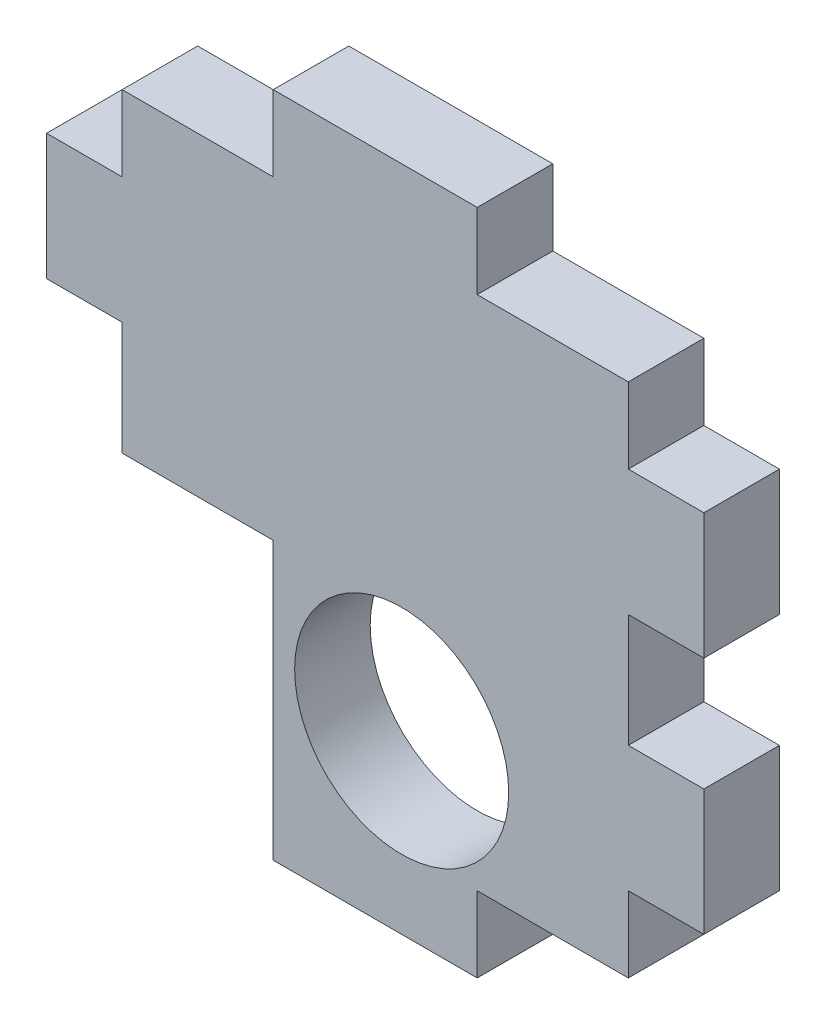
ISO-10303-21;
HEADER;
FILE_DESCRIPTION(('STEP AP214'),'2;1');
FILE_NAME('part.step','',(''),(''),'','','');
FILE_SCHEMA(('AUTOMOTIVE_DESIGN { 1 0 10303 214 1 1 1 1 }'));
ENDSEC;
DATA;
#1=APPLICATION_CONTEXT('core data for automotive mechanical design processes');
#2=APPLICATION_PROTOCOL_DEFINITION('international standard','automotive_design',2000,#1);
#3=PRODUCT_CONTEXT('',#1,'mechanical');
#4=PRODUCT('Part','Part','',(#3));
#5=PRODUCT_RELATED_PRODUCT_CATEGORY('part','',(#4));
#6=PRODUCT_DEFINITION_FORMATION('','',#4);
#7=PRODUCT_DEFINITION_CONTEXT('part definition',#1,'design');
#8=PRODUCT_DEFINITION('design','',#6,#7);
#9=PRODUCT_DEFINITION_SHAPE('','',#8);
#10=(LENGTH_UNIT() NAMED_UNIT(*) SI_UNIT(.MILLI.,.METRE.));
#11=(NAMED_UNIT(*) PLANE_ANGLE_UNIT() SI_UNIT($,.RADIAN.));
#12=(NAMED_UNIT(*) SI_UNIT($,.STERADIAN.) SOLID_ANGLE_UNIT());
#13=UNCERTAINTY_MEASURE_WITH_UNIT(LENGTH_MEASURE(1.E-05),#10,'distance_accuracy_value','');
#14=(GEOMETRIC_REPRESENTATION_CONTEXT(3) GLOBAL_UNCERTAINTY_ASSIGNED_CONTEXT((#13)) GLOBAL_UNIT_ASSIGNED_CONTEXT((#10,
#11,#12)) REPRESENTATION_CONTEXT('',''));
#15=CARTESIAN_POINT('',(0.,0.,0.));
#16=DIRECTION('',(0.,0.,1.));
#17=DIRECTION('',(1.,0.,0.));
#18=AXIS2_PLACEMENT_3D('',#15,#16,#17);
#19=CARTESIAN_POINT('',(6.,0.,3.));
#20=DIRECTION('',(1.,0.,0.));
#21=DIRECTION('',(0.,0.,-1.));
#22=AXIS2_PLACEMENT_3D('',#19,#20,#21);
#23=PLANE('',#22);
#24=DIRECTION('',(0.,-1.,0.));
#25=VECTOR('',#24,1.);
#26=CARTESIAN_POINT('',(6.,0.,0.));
#27=LINE('',#26,#25);
#28=CARTESIAN_POINT('',(6.,8.,0.));
#29=VERTEX_POINT('',#28);
#30=CARTESIAN_POINT('',(6.,-3.,0.));
#31=VERTEX_POINT('',#30);
#32=EDGE_CURVE('E49',#29,#31,#27,.T.);
#33=ORIENTED_EDGE('',*,*,#32,.T.);
#34=DIRECTION('',(0.,0.,-1.));
#35=VECTOR('',#34,1.);
#36=CARTESIAN_POINT('',(6.,-3.,3.));
#37=LINE('',#36,#35);
#38=CARTESIAN_POINT('',(6.,-3.,3.));
#39=VERTEX_POINT('',#38);
#40=EDGE_CURVE('E11',#39,#31,#37,.T.);
#41=ORIENTED_EDGE('',*,*,#40,.F.);
#42=DIRECTION('',(0.,-1.,0.));
#43=VECTOR('',#42,1.);
#44=CARTESIAN_POINT('',(6.,0.,3.));
#45=LINE('',#44,#43);
#46=CARTESIAN_POINT('',(6.,8.,3.));
#47=VERTEX_POINT('',#46);
#48=EDGE_CURVE('E140',#47,#39,#45,.T.);
#49=ORIENTED_EDGE('',*,*,#48,.F.);
#50=DIRECTION('',(0.,0.,1.));
#51=VECTOR('',#50,1.);
#52=CARTESIAN_POINT('',(6.,8.,0.));
#53=LINE('',#52,#51);
#54=EDGE_CURVE('E404',#29,#47,#53,.T.);
#55=ORIENTED_EDGE('',*,*,#54,.F.);
#56=EDGE_LOOP('',(#33,#41,#49,#55));
#57=FACE_BOUND('',#56,.T.);
#58=ADVANCED_FACE('F35',(#57),#23,.F.);
#59=CARTESIAN_POINT('',(6.,-3.,3.));
#60=DIRECTION('',(0.,1.,0.));
#61=DIRECTION('',(0.,0.,1.));
#62=AXIS2_PLACEMENT_3D('',#59,#60,#61);
#63=PLANE('',#62);
#64=DIRECTION('',(1.,0.,0.));
#65=VECTOR('',#64,1.);
#66=CARTESIAN_POINT('',(6.,-3.,0.));
#67=LINE('',#66,#65);
#68=CARTESIAN_POINT('',(14.1,-3.,0.));
#69=VERTEX_POINT('',#68);
#70=EDGE_CURVE('E229',#31,#69,#67,.T.);
#71=ORIENTED_EDGE('',*,*,#70,.T.);
#72=DIRECTION('',(0.,0.,-1.));
#73=VECTOR('',#72,1.);
#74=CARTESIAN_POINT('',(14.1,-3.,3.));
#75=LINE('',#74,#73);
#76=CARTESIAN_POINT('',(14.1,-3.,3.));
#77=VERTEX_POINT('',#76);
#78=EDGE_CURVE('E42',#77,#69,#75,.T.);
#79=ORIENTED_EDGE('',*,*,#78,.F.);
#80=DIRECTION('',(1.,0.,0.));
#81=VECTOR('',#80,1.);
#82=CARTESIAN_POINT('',(6.,-3.,3.));
#83=LINE('',#82,#81);
#84=EDGE_CURVE('E406',#39,#77,#83,.T.);
#85=ORIENTED_EDGE('',*,*,#84,.F.);
#86=ORIENTED_EDGE('',*,*,#40,.T.);
#87=EDGE_LOOP('',(#71,#79,#85,#86));
#88=FACE_BOUND('',#87,.T.);
#89=ADVANCED_FACE('F417',(#88),#63,.F.);
#90=CARTESIAN_POINT('',(14.1,-3.,3.));
#91=DIRECTION('',(-1.,0.,0.));
#92=DIRECTION('',(0.,-1.,0.));
#93=AXIS2_PLACEMENT_3D('',#90,#91,#92);
#94=PLANE('',#93);
#95=DIRECTION('',(0.,1.,0.));
#96=VECTOR('',#95,1.);
#97=CARTESIAN_POINT('',(14.1,-3.,0.));
#98=LINE('',#97,#96);
#99=CARTESIAN_POINT('',(14.1,0.,0.));
#100=VERTEX_POINT('',#99);
#101=EDGE_CURVE('E232',#69,#100,#98,.T.);
#102=ORIENTED_EDGE('',*,*,#101,.T.);
#103=DIRECTION('',(0.,0.,-1.));
#104=VECTOR('',#103,1.);
#105=CARTESIAN_POINT('',(14.1,0.,3.));
#106=LINE('',#105,#104);
#107=CARTESIAN_POINT('',(14.1,0.,3.));
#108=VERTEX_POINT('',#107);
#109=EDGE_CURVE('E324',#108,#100,#106,.T.);
#110=ORIENTED_EDGE('',*,*,#109,.F.);
#111=DIRECTION('',(0.,1.,0.));
#112=VECTOR('',#111,1.);
#113=CARTESIAN_POINT('',(14.1,-3.,3.));
#114=LINE('',#113,#112);
#115=EDGE_CURVE('E333',#77,#108,#114,.T.);
#116=ORIENTED_EDGE('',*,*,#115,.F.);
#117=ORIENTED_EDGE('',*,*,#78,.T.);
#118=EDGE_LOOP('',(#102,#110,#116,#117));
#119=FACE_BOUND('',#118,.T.);
#120=ADVANCED_FACE('F331',(#119),#94,.F.);
#121=CARTESIAN_POINT('',(14.1,0.,3.));
#122=DIRECTION('',(0.,1.,0.));
#123=DIRECTION('',(0.,0.,1.));
#124=AXIS2_PLACEMENT_3D('',#121,#122,#123);
#125=PLANE('',#124);
#126=DIRECTION('',(1.,0.,0.));
#127=VECTOR('',#126,1.);
#128=CARTESIAN_POINT('',(14.1,0.,0.));
#129=LINE('',#128,#127);
#130=CARTESIAN_POINT('',(20.1,0.,0.));
#131=VERTEX_POINT('',#130);
#132=EDGE_CURVE('E234',#100,#131,#129,.T.);
#133=ORIENTED_EDGE('',*,*,#132,.T.);
#134=DIRECTION('',(0.,0.,-1.));
#135=VECTOR('',#134,1.);
#136=CARTESIAN_POINT('',(20.1,0.,3.));
#137=LINE('',#136,#135);
#138=CARTESIAN_POINT('',(20.1,0.,3.));
#139=VERTEX_POINT('',#138);
#140=EDGE_CURVE('E321',#139,#131,#137,.T.);
#141=ORIENTED_EDGE('',*,*,#140,.F.);
#142=DIRECTION('',(1.,0.,0.));
#143=VECTOR('',#142,1.);
#144=CARTESIAN_POINT('',(14.1,0.,3.));
#145=LINE('',#144,#143);
#146=EDGE_CURVE('E351',#108,#139,#145,.T.);
#147=ORIENTED_EDGE('',*,*,#146,.F.);
#148=ORIENTED_EDGE('',*,*,#109,.T.);
#149=EDGE_LOOP('',(#133,#141,#147,#148));
#150=FACE_BOUND('',#149,.T.);
#151=ADVANCED_FACE('F342',(#150),#125,.F.);
#152=CARTESIAN_POINT('',(20.1,0.,3.));
#153=DIRECTION('',(-1.,0.,0.));
#154=DIRECTION('',(0.,-1.,0.));
#155=AXIS2_PLACEMENT_3D('',#152,#153,#154);
#156=PLANE('',#155);
#157=DIRECTION('',(0.,1.,0.));
#158=VECTOR('',#157,1.);
#159=CARTESIAN_POINT('',(20.1,0.,0.));
#160=LINE('',#159,#158);
#161=CARTESIAN_POINT('',(20.1,3.,0.));
#162=VERTEX_POINT('',#161);
#163=EDGE_CURVE('E236',#131,#162,#160,.T.);
#164=ORIENTED_EDGE('',*,*,#163,.T.);
#165=DIRECTION('',(0.,0.,-1.));
#166=VECTOR('',#165,1.);
#167=CARTESIAN_POINT('',(20.1,3.,3.));
#168=LINE('',#167,#166);
#169=CARTESIAN_POINT('',(20.1,3.,3.));
#170=VERTEX_POINT('',#169);
#171=EDGE_CURVE('E318',#170,#162,#168,.T.);
#172=ORIENTED_EDGE('',*,*,#171,.F.);
#173=DIRECTION('',(0.,1.,0.));
#174=VECTOR('',#173,1.);
#175=CARTESIAN_POINT('',(20.1,0.,3.));
#176=LINE('',#175,#174);
#177=EDGE_CURVE('E348',#139,#170,#176,.T.);
#178=ORIENTED_EDGE('',*,*,#177,.F.);
#179=ORIENTED_EDGE('',*,*,#140,.T.);
#180=EDGE_LOOP('',(#164,#172,#178,#179));
#181=FACE_BOUND('',#180,.T.);
#182=ADVANCED_FACE('F346',(#181),#156,.F.);
#183=CARTESIAN_POINT('',(20.1,3.,3.));
#184=DIRECTION('',(0.,1.,0.));
#185=DIRECTION('',(0.,0.,1.));
#186=AXIS2_PLACEMENT_3D('',#183,#184,#185);
#187=PLANE('',#186);
#188=DIRECTION('',(1.,0.,0.));
#189=VECTOR('',#188,1.);
#190=CARTESIAN_POINT('',(20.1,3.,0.));
#191=LINE('',#190,#189);
#192=CARTESIAN_POINT('',(23.1,3.,0.));
#193=VERTEX_POINT('',#192);
#194=EDGE_CURVE('E238',#162,#193,#191,.T.);
#195=ORIENTED_EDGE('',*,*,#194,.T.);
#196=DIRECTION('',(0.,0.,-1.));
#197=VECTOR('',#196,1.);
#198=CARTESIAN_POINT('',(23.1,3.,3.));
#199=LINE('',#198,#197);
#200=CARTESIAN_POINT('',(23.1,3.,3.));
#201=VERTEX_POINT('',#200);
#202=EDGE_CURVE('E315',#201,#193,#199,.T.);
#203=ORIENTED_EDGE('',*,*,#202,.F.);
#204=DIRECTION('',(1.,0.,0.));
#205=VECTOR('',#204,1.);
#206=CARTESIAN_POINT('',(20.1,3.,3.));
#207=LINE('',#206,#205);
#208=EDGE_CURVE('E350',#170,#201,#207,.T.);
#209=ORIENTED_EDGE('',*,*,#208,.F.);
#210=ORIENTED_EDGE('',*,*,#171,.T.);
#211=EDGE_LOOP('',(#195,#203,#209,#210));
#212=FACE_BOUND('',#211,.T.);
#213=ADVANCED_FACE('F429',(#212),#187,.F.);
#214=CARTESIAN_POINT('',(23.1,3.,3.));
#215=DIRECTION('',(-1.,0.,0.));
#216=DIRECTION('',(0.,-1.,0.));
#217=AXIS2_PLACEMENT_3D('',#214,#215,#216);
#218=PLANE('',#217);
#219=DIRECTION('',(0.,1.,0.));
#220=VECTOR('',#219,1.);
#221=CARTESIAN_POINT('',(23.1,3.,0.));
#222=LINE('',#221,#220);
#223=CARTESIAN_POINT('',(23.1,8.,0.));
#224=VERTEX_POINT('',#223);
#225=EDGE_CURVE('E240',#193,#224,#222,.T.);
#226=ORIENTED_EDGE('',*,*,#225,.T.);
#227=DIRECTION('',(0.,0.,-1.));
#228=VECTOR('',#227,1.);
#229=CARTESIAN_POINT('',(23.1,8.,3.));
#230=LINE('',#229,#228);
#231=CARTESIAN_POINT('',(23.1,8.,3.));
#232=VERTEX_POINT('',#231);
#233=EDGE_CURVE('E312',#232,#224,#230,.T.);
#234=ORIENTED_EDGE('',*,*,#233,.F.);
#235=DIRECTION('',(0.,1.,0.));
#236=VECTOR('',#235,1.);
#237=CARTESIAN_POINT('',(23.1,3.,3.));
#238=LINE('',#237,#236);
#239=EDGE_CURVE('E353',#201,#232,#238,.T.);
#240=ORIENTED_EDGE('',*,*,#239,.F.);
#241=ORIENTED_EDGE('',*,*,#202,.T.);
#242=EDGE_LOOP('',(#226,#234,#240,#241));
#243=FACE_BOUND('',#242,.T.);
#244=ADVANCED_FACE('F432',(#243),#218,.F.);
#245=CARTESIAN_POINT('',(23.1,8.,3.));
#246=DIRECTION('',(0.,-1.,0.));
#247=DIRECTION('',(1.,0.,0.));
#248=AXIS2_PLACEMENT_3D('',#245,#246,#247);
#249=PLANE('',#248);
#250=DIRECTION('',(-1.,0.,0.));
#251=VECTOR('',#250,1.);
#252=CARTESIAN_POINT('',(23.1,8.,0.));
#253=LINE('',#252,#251);
#254=CARTESIAN_POINT('',(20.1,8.,0.));
#255=VERTEX_POINT('',#254);
#256=EDGE_CURVE('E242',#224,#255,#253,.T.);
#257=ORIENTED_EDGE('',*,*,#256,.T.);
#258=DIRECTION('',(0.,0.,-1.));
#259=VECTOR('',#258,1.);
#260=CARTESIAN_POINT('',(20.1,8.,3.));
#261=LINE('',#260,#259);
#262=CARTESIAN_POINT('',(20.1,8.,3.));
#263=VERTEX_POINT('',#262);
#264=EDGE_CURVE('E309',#263,#255,#261,.T.);
#265=ORIENTED_EDGE('',*,*,#264,.F.);
#266=DIRECTION('',(-1.,0.,0.));
#267=VECTOR('',#266,1.);
#268=CARTESIAN_POINT('',(23.1,8.,3.));
#269=LINE('',#268,#267);
#270=EDGE_CURVE('E359',#232,#263,#269,.T.);
#271=ORIENTED_EDGE('',*,*,#270,.F.);
#272=ORIENTED_EDGE('',*,*,#233,.T.);
#273=EDGE_LOOP('',(#257,#265,#271,#272));
#274=FACE_BOUND('',#273,.T.);
#275=ADVANCED_FACE('F436',(#274),#249,.F.);
#276=CARTESIAN_POINT('',(20.1,8.,3.));
#277=DIRECTION('',(-1.,0.,0.));
#278=DIRECTION('',(0.,-1.,0.));
#279=AXIS2_PLACEMENT_3D('',#276,#277,#278);
#280=PLANE('',#279);
#281=DIRECTION('',(0.,1.,0.));
#282=VECTOR('',#281,1.);
#283=CARTESIAN_POINT('',(20.1,8.,0.));
#284=LINE('',#283,#282);
#285=CARTESIAN_POINT('',(20.1,12.5,0.));
#286=VERTEX_POINT('',#285);
#287=EDGE_CURVE('E244',#255,#286,#284,.T.);
#288=ORIENTED_EDGE('',*,*,#287,.T.);
#289=DIRECTION('',(0.,0.,-1.));
#290=VECTOR('',#289,1.);
#291=CARTESIAN_POINT('',(20.1,12.5,3.));
#292=LINE('',#291,#290);
#293=CARTESIAN_POINT('',(20.1,12.5,3.));
#294=VERTEX_POINT('',#293);
#295=EDGE_CURVE('E306',#294,#286,#292,.T.);
#296=ORIENTED_EDGE('',*,*,#295,.F.);
#297=DIRECTION('',(0.,1.,0.));
#298=VECTOR('',#297,1.);
#299=CARTESIAN_POINT('',(20.1,8.,3.));
#300=LINE('',#299,#298);
#301=EDGE_CURVE('E361',#263,#294,#300,.T.);
#302=ORIENTED_EDGE('',*,*,#301,.F.);
#303=ORIENTED_EDGE('',*,*,#264,.T.);
#304=EDGE_LOOP('',(#288,#296,#302,#303));
#305=FACE_BOUND('',#304,.T.);
#306=ADVANCED_FACE('F440',(#305),#280,.F.);
#307=CARTESIAN_POINT('',(20.1,12.5,3.));
#308=DIRECTION('',(0.,1.,0.));
#309=DIRECTION('',(0.,0.,1.));
#310=AXIS2_PLACEMENT_3D('',#307,#308,#309);
#311=PLANE('',#310);
#312=DIRECTION('',(1.,0.,0.));
#313=VECTOR('',#312,1.);
#314=CARTESIAN_POINT('',(20.1,12.5,0.));
#315=LINE('',#314,#313);
#316=CARTESIAN_POINT('',(23.1,12.5,0.));
#317=VERTEX_POINT('',#316);
#318=EDGE_CURVE('E246',#286,#317,#315,.T.);
#319=ORIENTED_EDGE('',*,*,#318,.T.);
#320=DIRECTION('',(0.,0.,-1.));
#321=VECTOR('',#320,1.);
#322=CARTESIAN_POINT('',(23.1,12.5,3.));
#323=LINE('',#322,#321);
#324=CARTESIAN_POINT('',(23.1,12.5,3.));
#325=VERTEX_POINT('',#324);
#326=EDGE_CURVE('E303',#325,#317,#323,.T.);
#327=ORIENTED_EDGE('',*,*,#326,.F.);
#328=DIRECTION('',(1.,0.,0.));
#329=VECTOR('',#328,1.);
#330=CARTESIAN_POINT('',(20.1,12.5,3.));
#331=LINE('',#330,#329);
#332=EDGE_CURVE('E363',#294,#325,#331,.T.);
#333=ORIENTED_EDGE('',*,*,#332,.F.);
#334=ORIENTED_EDGE('',*,*,#295,.T.);
#335=EDGE_LOOP('',(#319,#327,#333,#334));
#336=FACE_BOUND('',#335,.T.);
#337=ADVANCED_FACE('F444',(#336),#311,.F.);
#338=CARTESIAN_POINT('',(23.1,12.5,3.));
#339=DIRECTION('',(-1.,0.,0.));
#340=DIRECTION('',(0.,-1.,0.));
#341=AXIS2_PLACEMENT_3D('',#338,#339,#340);
#342=PLANE('',#341);
#343=DIRECTION('',(0.,1.,0.));
#344=VECTOR('',#343,1.);
#345=CARTESIAN_POINT('',(23.1,12.5,0.));
#346=LINE('',#345,#344);
#347=CARTESIAN_POINT('',(23.1,17.5,0.));
#348=VERTEX_POINT('',#347);
#349=EDGE_CURVE('E248',#317,#348,#346,.T.);
#350=ORIENTED_EDGE('',*,*,#349,.T.);
#351=DIRECTION('',(0.,0.,-1.));
#352=VECTOR('',#351,1.);
#353=CARTESIAN_POINT('',(23.1,17.5,3.));
#354=LINE('',#353,#352);
#355=CARTESIAN_POINT('',(23.1,17.5,3.));
#356=VERTEX_POINT('',#355);
#357=EDGE_CURVE('E300',#356,#348,#354,.T.);
#358=ORIENTED_EDGE('',*,*,#357,.F.);
#359=DIRECTION('',(0.,1.,0.));
#360=VECTOR('',#359,1.);
#361=CARTESIAN_POINT('',(23.1,12.5,3.));
#362=LINE('',#361,#360);
#363=EDGE_CURVE('E365',#325,#356,#362,.T.);
#364=ORIENTED_EDGE('',*,*,#363,.F.);
#365=ORIENTED_EDGE('',*,*,#326,.T.);
#366=EDGE_LOOP('',(#350,#358,#364,#365));
#367=FACE_BOUND('',#366,.T.);
#368=ADVANCED_FACE('F448',(#367),#342,.F.);
#369=CARTESIAN_POINT('',(23.1,17.5,3.));
#370=DIRECTION('',(0.,-1.,0.));
#371=DIRECTION('',(0.,0.,-1.));
#372=AXIS2_PLACEMENT_3D('',#369,#370,#371);
#373=PLANE('',#372);
#374=DIRECTION('',(-1.,0.,0.));
#375=VECTOR('',#374,1.);
#376=CARTESIAN_POINT('',(23.1,17.5,0.));
#377=LINE('',#376,#375);
#378=CARTESIAN_POINT('',(20.1,17.5,0.));
#379=VERTEX_POINT('',#378);
#380=EDGE_CURVE('E250',#348,#379,#377,.T.);
#381=ORIENTED_EDGE('',*,*,#380,.T.);
#382=DIRECTION('',(0.,0.,-1.));
#383=VECTOR('',#382,1.);
#384=CARTESIAN_POINT('',(20.1,17.5,3.));
#385=LINE('',#384,#383);
#386=CARTESIAN_POINT('',(20.1,17.5,3.));
#387=VERTEX_POINT('',#386);
#388=EDGE_CURVE('E297',#387,#379,#385,.T.);
#389=ORIENTED_EDGE('',*,*,#388,.F.);
#390=DIRECTION('',(-1.,0.,0.));
#391=VECTOR('',#390,1.);
#392=CARTESIAN_POINT('',(23.1,17.5,3.));
#393=LINE('',#392,#391);
#394=EDGE_CURVE('E367',#356,#387,#393,.T.);
#395=ORIENTED_EDGE('',*,*,#394,.F.);
#396=ORIENTED_EDGE('',*,*,#357,.T.);
#397=EDGE_LOOP('',(#381,#389,#395,#396));
#398=FACE_BOUND('',#397,.T.);
#399=ADVANCED_FACE('F452',(#398),#373,.F.);
#400=CARTESIAN_POINT('',(20.1,17.5,3.));
#401=DIRECTION('',(-1.,0.,0.));
#402=DIRECTION('',(0.,0.,1.));
#403=AXIS2_PLACEMENT_3D('',#400,#401,#402);
#404=PLANE('',#403);
#405=DIRECTION('',(0.,1.,0.));
#406=VECTOR('',#405,1.);
#407=CARTESIAN_POINT('',(20.1,17.5,0.));
#408=LINE('',#407,#406);
#409=CARTESIAN_POINT('',(20.1,20.5,0.));
#410=VERTEX_POINT('',#409);
#411=EDGE_CURVE('E252',#379,#410,#408,.T.);
#412=ORIENTED_EDGE('',*,*,#411,.T.);
#413=DIRECTION('',(0.,0.,-1.));
#414=VECTOR('',#413,1.);
#415=CARTESIAN_POINT('',(20.1,20.5,3.));
#416=LINE('',#415,#414);
#417=CARTESIAN_POINT('',(20.1,20.5,3.));
#418=VERTEX_POINT('',#417);
#419=EDGE_CURVE('E294',#418,#410,#416,.T.);
#420=ORIENTED_EDGE('',*,*,#419,.F.);
#421=DIRECTION('',(0.,1.,0.));
#422=VECTOR('',#421,1.);
#423=CARTESIAN_POINT('',(20.1,17.5,3.));
#424=LINE('',#423,#422);
#425=EDGE_CURVE('E369',#387,#418,#424,.T.);
#426=ORIENTED_EDGE('',*,*,#425,.F.);
#427=ORIENTED_EDGE('',*,*,#388,.T.);
#428=EDGE_LOOP('',(#412,#420,#426,#427));
#429=FACE_BOUND('',#428,.T.);
#430=ADVANCED_FACE('F456',(#429),#404,.F.);
#431=CARTESIAN_POINT('',(20.1,20.5,3.));
#432=DIRECTION('',(0.,-1.,0.));
#433=DIRECTION('',(0.,0.,-1.));
#434=AXIS2_PLACEMENT_3D('',#431,#432,#433);
#435=PLANE('',#434);
#436=DIRECTION('',(-1.,0.,0.));
#437=VECTOR('',#436,1.);
#438=CARTESIAN_POINT('',(20.1,20.5,0.));
#439=LINE('',#438,#437);
#440=CARTESIAN_POINT('',(14.1,20.5,0.));
#441=VERTEX_POINT('',#440);
#442=EDGE_CURVE('E254',#410,#441,#439,.T.);
#443=ORIENTED_EDGE('',*,*,#442,.T.);
#444=DIRECTION('',(0.,0.,-1.));
#445=VECTOR('',#444,1.);
#446=CARTESIAN_POINT('',(14.1,20.5,3.));
#447=LINE('',#446,#445);
#448=CARTESIAN_POINT('',(14.1,20.5,3.));
#449=VERTEX_POINT('',#448);
#450=EDGE_CURVE('E291',#449,#441,#447,.T.);
#451=ORIENTED_EDGE('',*,*,#450,.F.);
#452=DIRECTION('',(-1.,0.,0.));
#453=VECTOR('',#452,1.);
#454=CARTESIAN_POINT('',(20.1,20.5,3.));
#455=LINE('',#454,#453);
#456=EDGE_CURVE('E371',#418,#449,#455,.T.);
#457=ORIENTED_EDGE('',*,*,#456,.F.);
#458=ORIENTED_EDGE('',*,*,#419,.T.);
#459=EDGE_LOOP('',(#443,#451,#457,#458));
#460=FACE_BOUND('',#459,.T.);
#461=ADVANCED_FACE('F460',(#460),#435,.F.);
#462=CARTESIAN_POINT('',(14.1,20.5,3.));
#463=DIRECTION('',(-1.,0.,0.));
#464=DIRECTION('',(0.,0.,1.));
#465=AXIS2_PLACEMENT_3D('',#462,#463,#464);
#466=PLANE('',#465);
#467=DIRECTION('',(0.,1.,0.));
#468=VECTOR('',#467,1.);
#469=CARTESIAN_POINT('',(14.1,20.5,0.));
#470=LINE('',#469,#468);
#471=CARTESIAN_POINT('',(14.1,23.5,0.));
#472=VERTEX_POINT('',#471);
#473=EDGE_CURVE('E256',#441,#472,#470,.T.);
#474=ORIENTED_EDGE('',*,*,#473,.T.);
#475=DIRECTION('',(0.,0.,-1.));
#476=VECTOR('',#475,1.);
#477=CARTESIAN_POINT('',(14.1,23.5,3.));
#478=LINE('',#477,#476);
#479=CARTESIAN_POINT('',(14.1,23.5,3.));
#480=VERTEX_POINT('',#479);
#481=EDGE_CURVE('E288',#480,#472,#478,.T.);
#482=ORIENTED_EDGE('',*,*,#481,.F.);
#483=DIRECTION('',(0.,1.,0.));
#484=VECTOR('',#483,1.);
#485=CARTESIAN_POINT('',(14.1,20.5,3.));
#486=LINE('',#485,#484);
#487=EDGE_CURVE('E373',#449,#480,#486,.T.);
#488=ORIENTED_EDGE('',*,*,#487,.F.);
#489=ORIENTED_EDGE('',*,*,#450,.T.);
#490=EDGE_LOOP('',(#474,#482,#488,#489));
#491=FACE_BOUND('',#490,.T.);
#492=ADVANCED_FACE('F464',(#491),#466,.F.);
#493=CARTESIAN_POINT('',(14.1,23.5,3.));
#494=DIRECTION('',(0.,-1.,0.));
#495=DIRECTION('',(0.,0.,-1.));
#496=AXIS2_PLACEMENT_3D('',#493,#494,#495);
#497=PLANE('',#496);
#498=DIRECTION('',(-1.,0.,0.));
#499=VECTOR('',#498,1.);
#500=CARTESIAN_POINT('',(14.1,23.5,0.));
#501=LINE('',#500,#499);
#502=CARTESIAN_POINT('',(5.99999999999999,23.5,0.));
#503=VERTEX_POINT('',#502);
#504=EDGE_CURVE('E258',#472,#503,#501,.T.);
#505=ORIENTED_EDGE('',*,*,#504,.T.);
#506=DIRECTION('',(0.,0.,-1.));
#507=VECTOR('',#506,1.);
#508=CARTESIAN_POINT('',(5.99999999999999,23.5,3.));
#509=LINE('',#508,#507);
#510=CARTESIAN_POINT('',(5.99999999999999,23.5,3.));
#511=VERTEX_POINT('',#510);
#512=EDGE_CURVE('E285',#511,#503,#509,.T.);
#513=ORIENTED_EDGE('',*,*,#512,.F.);
#514=DIRECTION('',(-1.,0.,0.));
#515=VECTOR('',#514,1.);
#516=CARTESIAN_POINT('',(14.1,23.5,3.));
#517=LINE('',#516,#515);
#518=EDGE_CURVE('E375',#480,#511,#517,.T.);
#519=ORIENTED_EDGE('',*,*,#518,.F.);
#520=ORIENTED_EDGE('',*,*,#481,.T.);
#521=EDGE_LOOP('',(#505,#513,#519,#520));
#522=FACE_BOUND('',#521,.T.);
#523=ADVANCED_FACE('F468',(#522),#497,.F.);
#524=CARTESIAN_POINT('',(5.99999999999999,23.5,3.));
#525=DIRECTION('',(1.,0.,0.));
#526=DIRECTION('',(0.,1.,0.));
#527=AXIS2_PLACEMENT_3D('',#524,#525,#526);
#528=PLANE('',#527);
#529=DIRECTION('',(0.,-1.,0.));
#530=VECTOR('',#529,1.);
#531=CARTESIAN_POINT('',(5.99999999999999,23.5,0.));
#532=LINE('',#531,#530);
#533=CARTESIAN_POINT('',(6.,20.5,0.));
#534=VERTEX_POINT('',#533);
#535=EDGE_CURVE('E260',#503,#534,#532,.T.);
#536=ORIENTED_EDGE('',*,*,#535,.T.);
#537=DIRECTION('',(0.,0.,-1.));
#538=VECTOR('',#537,1.);
#539=CARTESIAN_POINT('',(6.,20.5,3.));
#540=LINE('',#539,#538);
#541=CARTESIAN_POINT('',(6.,20.5,3.));
#542=VERTEX_POINT('',#541);
#543=EDGE_CURVE('E282',#542,#534,#540,.T.);
#544=ORIENTED_EDGE('',*,*,#543,.F.);
#545=DIRECTION('',(0.,-1.,0.));
#546=VECTOR('',#545,1.);
#547=CARTESIAN_POINT('',(5.99999999999999,23.5,3.));
#548=LINE('',#547,#546);
#549=EDGE_CURVE('E377',#511,#542,#548,.T.);
#550=ORIENTED_EDGE('',*,*,#549,.F.);
#551=ORIENTED_EDGE('',*,*,#512,.T.);
#552=EDGE_LOOP('',(#536,#544,#550,#551));
#553=FACE_BOUND('',#552,.T.);
#554=ADVANCED_FACE('F472',(#553),#528,.F.);
#555=CARTESIAN_POINT('',(6.,20.5,3.));
#556=DIRECTION('',(0.,-1.,0.));
#557=DIRECTION('',(0.,0.,-1.));
#558=AXIS2_PLACEMENT_3D('',#555,#556,#557);
#559=PLANE('',#558);
#560=DIRECTION('',(-1.,0.,0.));
#561=VECTOR('',#560,1.);
#562=CARTESIAN_POINT('',(6.,20.5,0.));
#563=LINE('',#562,#561);
#564=CARTESIAN_POINT('',(0.,20.5,0.));
#565=VERTEX_POINT('',#564);
#566=EDGE_CURVE('E262',#534,#565,#563,.T.);
#567=ORIENTED_EDGE('',*,*,#566,.T.);
#568=DIRECTION('',(0.,0.,-1.));
#569=VECTOR('',#568,1.);
#570=CARTESIAN_POINT('',(0.,20.5,3.));
#571=LINE('',#570,#569);
#572=CARTESIAN_POINT('',(0.,20.5,3.));
#573=VERTEX_POINT('',#572);
#574=EDGE_CURVE('E279',#573,#565,#571,.T.);
#575=ORIENTED_EDGE('',*,*,#574,.F.);
#576=DIRECTION('',(-1.,0.,0.));
#577=VECTOR('',#576,1.);
#578=CARTESIAN_POINT('',(6.,20.5,3.));
#579=LINE('',#578,#577);
#580=EDGE_CURVE('E379',#542,#573,#579,.T.);
#581=ORIENTED_EDGE('',*,*,#580,.F.);
#582=ORIENTED_EDGE('',*,*,#543,.T.);
#583=EDGE_LOOP('',(#567,#575,#581,#582));
#584=FACE_BOUND('',#583,.T.);
#585=ADVANCED_FACE('F385',(#584),#559,.F.);
#586=CARTESIAN_POINT('',(0.,20.5,3.));
#587=DIRECTION('',(1.,0.,0.));
#588=DIRECTION('',(0.,1.,0.));
#589=AXIS2_PLACEMENT_3D('',#586,#587,#588);
#590=PLANE('',#589);
#591=DIRECTION('',(0.,-1.,0.));
#592=VECTOR('',#591,1.);
#593=CARTESIAN_POINT('',(0.,20.5,0.));
#594=LINE('',#593,#592);
#595=CARTESIAN_POINT('',(0.,17.5,0.));
#596=VERTEX_POINT('',#595);
#597=EDGE_CURVE('E264',#565,#596,#594,.T.);
#598=ORIENTED_EDGE('',*,*,#597,.T.);
#599=DIRECTION('',(0.,0.,-1.));
#600=VECTOR('',#599,1.);
#601=CARTESIAN_POINT('',(0.,17.5,3.));
#602=LINE('',#601,#600);
#603=CARTESIAN_POINT('',(0.,17.5,3.));
#604=VERTEX_POINT('',#603);
#605=EDGE_CURVE('E217',#604,#596,#602,.T.);
#606=ORIENTED_EDGE('',*,*,#605,.F.);
#607=DIRECTION('',(0.,-1.,0.));
#608=VECTOR('',#607,1.);
#609=CARTESIAN_POINT('',(0.,20.5,3.));
#610=LINE('',#609,#608);
#611=EDGE_CURVE('E205',#573,#604,#610,.T.);
#612=ORIENTED_EDGE('',*,*,#611,.F.);
#613=ORIENTED_EDGE('',*,*,#574,.T.);
#614=EDGE_LOOP('',(#598,#606,#612,#613));
#615=FACE_BOUND('',#614,.T.);
#616=ADVANCED_FACE('F389',(#615),#590,.F.);
#617=CARTESIAN_POINT('',(0.,17.5,3.));
#618=DIRECTION('',(0.,-1.,0.));
#619=DIRECTION('',(0.,0.,-1.));
#620=AXIS2_PLACEMENT_3D('',#617,#618,#619);
#621=PLANE('',#620);
#622=DIRECTION('',(-1.,0.,0.));
#623=VECTOR('',#622,1.);
#624=CARTESIAN_POINT('',(0.,17.5,0.));
#625=LINE('',#624,#623);
#626=CARTESIAN_POINT('',(-3.,17.5,0.));
#627=VERTEX_POINT('',#626);
#628=EDGE_CURVE('E214',#596,#627,#625,.T.);
#629=ORIENTED_EDGE('',*,*,#628,.T.);
#630=DIRECTION('',(0.,0.,-1.));
#631=VECTOR('',#630,1.);
#632=CARTESIAN_POINT('',(-3.,17.5,3.));
#633=LINE('',#632,#631);
#634=CARTESIAN_POINT('',(-3.,17.5,3.));
#635=VERTEX_POINT('',#634);
#636=EDGE_CURVE('E211',#635,#627,#633,.T.);
#637=ORIENTED_EDGE('',*,*,#636,.F.);
#638=DIRECTION('',(-1.,0.,0.));
#639=VECTOR('',#638,1.);
#640=CARTESIAN_POINT('',(0.,17.5,3.));
#641=LINE('',#640,#639);
#642=EDGE_CURVE('E198',#604,#635,#641,.T.);
#643=ORIENTED_EDGE('',*,*,#642,.F.);
#644=ORIENTED_EDGE('',*,*,#605,.T.);
#645=EDGE_LOOP('',(#629,#637,#643,#644));
#646=FACE_BOUND('',#645,.T.);
#647=ADVANCED_FACE('F212',(#646),#621,.F.);
#648=CARTESIAN_POINT('',(-3.,17.5,3.));
#649=DIRECTION('',(1.,0.,0.));
#650=DIRECTION('',(0.,1.,0.));
#651=AXIS2_PLACEMENT_3D('',#648,#649,#650);
#652=PLANE('',#651);
#653=DIRECTION('',(0.,-1.,0.));
#654=VECTOR('',#653,1.);
#655=CARTESIAN_POINT('',(-3.,17.5,0.));
#656=LINE('',#655,#654);
#657=CARTESIAN_POINT('',(-3.,12.5,0.));
#658=VERTEX_POINT('',#657);
#659=EDGE_CURVE('E267',#627,#658,#656,.T.);
#660=ORIENTED_EDGE('',*,*,#659,.T.);
#661=DIRECTION('',(0.,0.,-1.));
#662=VECTOR('',#661,1.);
#663=CARTESIAN_POINT('',(-3.,12.5,3.));
#664=LINE('',#663,#662);
#665=CARTESIAN_POINT('',(-3.,12.5,3.));
#666=VERTEX_POINT('',#665);
#667=EDGE_CURVE('E218',#666,#658,#664,.T.);
#668=ORIENTED_EDGE('',*,*,#667,.F.);
#669=DIRECTION('',(0.,-1.,0.));
#670=VECTOR('',#669,1.);
#671=CARTESIAN_POINT('',(-3.,17.5,3.));
#672=LINE('',#671,#670);
#673=EDGE_CURVE('E202',#635,#666,#672,.T.);
#674=ORIENTED_EDGE('',*,*,#673,.F.);
#675=ORIENTED_EDGE('',*,*,#636,.T.);
#676=EDGE_LOOP('',(#660,#668,#674,#675));
#677=FACE_BOUND('',#676,.T.);
#678=ADVANCED_FACE('F220',(#677),#652,.F.);
#679=CARTESIAN_POINT('',(-3.,12.5,3.));
#680=DIRECTION('',(0.,1.,0.));
#681=DIRECTION('',(0.,0.,1.));
#682=AXIS2_PLACEMENT_3D('',#679,#680,#681);
#683=PLANE('',#682);
#684=DIRECTION('',(1.,0.,0.));
#685=VECTOR('',#684,1.);
#686=CARTESIAN_POINT('',(-3.,12.5,0.));
#687=LINE('',#686,#685);
#688=CARTESIAN_POINT('',(0.,12.5,0.));
#689=VERTEX_POINT('',#688);
#690=EDGE_CURVE('E132',#658,#689,#687,.T.);
#691=ORIENTED_EDGE('',*,*,#690,.T.);
#692=DIRECTION('',(0.,0.,-1.));
#693=VECTOR('',#692,1.);
#694=CARTESIAN_POINT('',(0.,12.5,3.));
#695=LINE('',#694,#693);
#696=CARTESIAN_POINT('',(0.,12.5,3.));
#697=VERTEX_POINT('',#696);
#698=EDGE_CURVE('E275',#697,#689,#695,.T.);
#699=ORIENTED_EDGE('',*,*,#698,.F.);
#700=DIRECTION('',(1.,0.,0.));
#701=VECTOR('',#700,1.);
#702=CARTESIAN_POINT('',(-3.,12.5,3.));
#703=LINE('',#702,#701);
#704=EDGE_CURVE('E58',#666,#697,#703,.T.);
#705=ORIENTED_EDGE('',*,*,#704,.F.);
#706=ORIENTED_EDGE('',*,*,#667,.T.);
#707=EDGE_LOOP('',(#691,#699,#705,#706));
#708=FACE_BOUND('',#707,.T.);
#709=ADVANCED_FACE('F391',(#708),#683,.F.);
#710=CARTESIAN_POINT('',(0.,12.5,3.));
#711=DIRECTION('',(1.,0.,0.));
#712=DIRECTION('',(0.,1.,0.));
#713=AXIS2_PLACEMENT_3D('',#710,#711,#712);
#714=PLANE('',#713);
#715=DIRECTION('',(0.,-1.,0.));
#716=VECTOR('',#715,1.);
#717=CARTESIAN_POINT('',(0.,12.5,0.));
#718=LINE('',#717,#716);
#719=CARTESIAN_POINT('',(0.,8.,0.));
#720=VERTEX_POINT('',#719);
#721=EDGE_CURVE('E270',#689,#720,#718,.T.);
#722=ORIENTED_EDGE('',*,*,#721,.T.);
#723=DIRECTION('',(0.,0.,-1.));
#724=VECTOR('',#723,1.);
#725=CARTESIAN_POINT('',(0.,8.,3.));
#726=LINE('',#725,#724);
#727=CARTESIAN_POINT('',(0.,8.,3.));
#728=VERTEX_POINT('',#727);
#729=EDGE_CURVE('E227',#728,#720,#726,.T.);
#730=ORIENTED_EDGE('',*,*,#729,.F.);
#731=DIRECTION('',(0.,-1.,0.));
#732=VECTOR('',#731,1.);
#733=CARTESIAN_POINT('',(0.,12.5,3.));
#734=LINE('',#733,#732);
#735=EDGE_CURVE('E222',#697,#728,#734,.T.);
#736=ORIENTED_EDGE('',*,*,#735,.F.);
#737=ORIENTED_EDGE('',*,*,#698,.T.);
#738=EDGE_LOOP('',(#722,#730,#736,#737));
#739=FACE_BOUND('',#738,.T.);
#740=ADVANCED_FACE('F395',(#739),#714,.F.);
#741=CARTESIAN_POINT('',(0.,0.,3.));
#742=DIRECTION('',(0.,0.,1.));
#743=DIRECTION('',(1.,0.,0.));
#744=AXIS2_PLACEMENT_3D('',#741,#742,#743);
#745=PLANE('',#744);
#746=CARTESIAN_POINT('',(11.1,4.,3.));
#747=DIRECTION('',(0.,0.,1.));
#748=DIRECTION('',(1.,0.,0.));
#749=AXIS2_PLACEMENT_3D('',#746,#747,#748);
#750=CIRCLE('',#749,4.25);
#751=CARTESIAN_POINT('',(15.35,4.,3.));
#752=VERTEX_POINT('',#751);
#753=EDGE_CURVE('E410',#752,#752,#750,.T.);
#754=ORIENTED_EDGE('',*,*,#753,.F.);
#755=EDGE_LOOP('',(#754));
#756=FACE_BOUND('',#755,.T.);
#757=DIRECTION('',(-1.,0.,0.));
#758=VECTOR('',#757,1.);
#759=CARTESIAN_POINT('',(0.,8.,3.));
#760=LINE('',#759,#758);
#761=EDGE_CURVE('E399',#47,#728,#760,.T.);
#762=ORIENTED_EDGE('',*,*,#761,.F.);
#763=ORIENTED_EDGE('',*,*,#48,.T.);
#764=ORIENTED_EDGE('',*,*,#84,.T.);
#765=ORIENTED_EDGE('',*,*,#115,.T.);
#766=ORIENTED_EDGE('',*,*,#146,.T.);
#767=ORIENTED_EDGE('',*,*,#177,.T.);
#768=ORIENTED_EDGE('',*,*,#208,.T.);
#769=ORIENTED_EDGE('',*,*,#239,.T.);
#770=ORIENTED_EDGE('',*,*,#270,.T.);
#771=ORIENTED_EDGE('',*,*,#301,.T.);
#772=ORIENTED_EDGE('',*,*,#332,.T.);
#773=ORIENTED_EDGE('',*,*,#363,.T.);
#774=ORIENTED_EDGE('',*,*,#394,.T.);
#775=ORIENTED_EDGE('',*,*,#425,.T.);
#776=ORIENTED_EDGE('',*,*,#456,.T.);
#777=ORIENTED_EDGE('',*,*,#487,.T.);
#778=ORIENTED_EDGE('',*,*,#518,.T.);
#779=ORIENTED_EDGE('',*,*,#549,.T.);
#780=ORIENTED_EDGE('',*,*,#580,.T.);
#781=ORIENTED_EDGE('',*,*,#611,.T.);
#782=ORIENTED_EDGE('',*,*,#642,.T.);
#783=ORIENTED_EDGE('',*,*,#673,.T.);
#784=ORIENTED_EDGE('',*,*,#704,.T.);
#785=ORIENTED_EDGE('',*,*,#735,.T.);
#786=EDGE_LOOP('',(#762,#763,#764,#765,#766,#767,#768,#769,#770,#771,#772,#773,#774,#775,#776,
#777,#778,#779,#780,#781,#782,#783,#784,#785));
#787=FACE_BOUND('',#786,.T.);
#788=ADVANCED_FACE('F200',(#756,#787),#745,.T.);
#789=CARTESIAN_POINT('',(0.,0.,0.));
#790=DIRECTION('',(0.,0.,1.));
#791=DIRECTION('',(1.,0.,0.));
#792=AXIS2_PLACEMENT_3D('',#789,#790,#791);
#793=PLANE('',#792);
#794=CARTESIAN_POINT('',(11.1,4.,0.));
#795=DIRECTION('',(0.,0.,1.));
#796=DIRECTION('',(1.,0.,0.));
#797=AXIS2_PLACEMENT_3D('',#794,#795,#796);
#798=CIRCLE('',#797,4.25);
#799=CARTESIAN_POINT('',(15.35,4.,0.));
#800=VERTEX_POINT('',#799);
#801=EDGE_CURVE('E230',#800,#800,#798,.T.);
#802=ORIENTED_EDGE('',*,*,#801,.T.);
#803=EDGE_LOOP('',(#802));
#804=FACE_BOUND('',#803,.T.);
#805=ORIENTED_EDGE('',*,*,#32,.F.);
#806=DIRECTION('',(-1.,0.,0.));
#807=VECTOR('',#806,1.);
#808=CARTESIAN_POINT('',(-3.,8.,0.));
#809=LINE('',#808,#807);
#810=EDGE_CURVE('E409',#29,#720,#809,.T.);
#811=ORIENTED_EDGE('',*,*,#810,.T.);
#812=ORIENTED_EDGE('',*,*,#721,.F.);
#813=ORIENTED_EDGE('',*,*,#690,.F.);
#814=ORIENTED_EDGE('',*,*,#659,.F.);
#815=ORIENTED_EDGE('',*,*,#628,.F.);
#816=ORIENTED_EDGE('',*,*,#597,.F.);
#817=ORIENTED_EDGE('',*,*,#566,.F.);
#818=ORIENTED_EDGE('',*,*,#535,.F.);
#819=ORIENTED_EDGE('',*,*,#504,.F.);
#820=ORIENTED_EDGE('',*,*,#473,.F.);
#821=ORIENTED_EDGE('',*,*,#442,.F.);
#822=ORIENTED_EDGE('',*,*,#411,.F.);
#823=ORIENTED_EDGE('',*,*,#380,.F.);
#824=ORIENTED_EDGE('',*,*,#349,.F.);
#825=ORIENTED_EDGE('',*,*,#318,.F.);
#826=ORIENTED_EDGE('',*,*,#287,.F.);
#827=ORIENTED_EDGE('',*,*,#256,.F.);
#828=ORIENTED_EDGE('',*,*,#225,.F.);
#829=ORIENTED_EDGE('',*,*,#194,.F.);
#830=ORIENTED_EDGE('',*,*,#163,.F.);
#831=ORIENTED_EDGE('',*,*,#132,.F.);
#832=ORIENTED_EDGE('',*,*,#101,.F.);
#833=ORIENTED_EDGE('',*,*,#70,.F.);
#834=EDGE_LOOP('',(#805,#811,#812,#813,#814,#815,#816,#817,#818,#819,#820,#821,#822,#823,#824,
#825,#826,#827,#828,#829,#830,#831,#832,#833));
#835=FACE_BOUND('',#834,.T.);
#836=ADVANCED_FACE('F337',(#804,#835),#793,.F.);
#837=CARTESIAN_POINT('',(0.,8.,0.));
#838=DIRECTION('',(0.,1.,0.));
#839=DIRECTION('',(0.,0.,1.));
#840=AXIS2_PLACEMENT_3D('',#837,#838,#839);
#841=PLANE('',#840);
#842=ORIENTED_EDGE('',*,*,#810,.F.);
#843=ORIENTED_EDGE('',*,*,#54,.T.);
#844=ORIENTED_EDGE('',*,*,#761,.T.);
#845=ORIENTED_EDGE('',*,*,#729,.T.);
#846=EDGE_LOOP('',(#842,#843,#844,#845));
#847=FACE_BOUND('',#846,.T.);
#848=ADVANCED_FACE('F408',(#847),#841,.F.);
#849=CARTESIAN_POINT('',(11.1,4.,0.));
#850=DIRECTION('',(0.,0.,1.));
#851=DIRECTION('',(1.,0.,0.));
#852=AXIS2_PLACEMENT_3D('',#849,#850,#851);
#853=CYLINDRICAL_SURFACE('',#852,4.25);
#854=ORIENTED_EDGE('',*,*,#801,.F.);
#855=EDGE_LOOP('',(#854));
#856=FACE_BOUND('',#855,.T.);
#857=ORIENTED_EDGE('',*,*,#753,.T.);
#858=EDGE_LOOP('',(#857));
#859=FACE_BOUND('',#858,.T.);
#860=ADVANCED_FACE('F497',(#856,#859),#853,.F.);
#861=CLOSED_SHELL('',(#58,#89,#120,#151,#182,#213,#244,#275,#306,#337,#368,#399,#430,#461,#492,
#523,#554,#585,#616,#647,#678,#709,#740,#788,#836,#848,#860));
#862=MANIFOLD_SOLID_BREP('B2',#861);
#863=ADVANCED_BREP_SHAPE_REPRESENTATION('',(#18,#862),#14);
#864=SHAPE_DEFINITION_REPRESENTATION(#9,#863);
ENDSEC;
END-ISO-10303-21;
